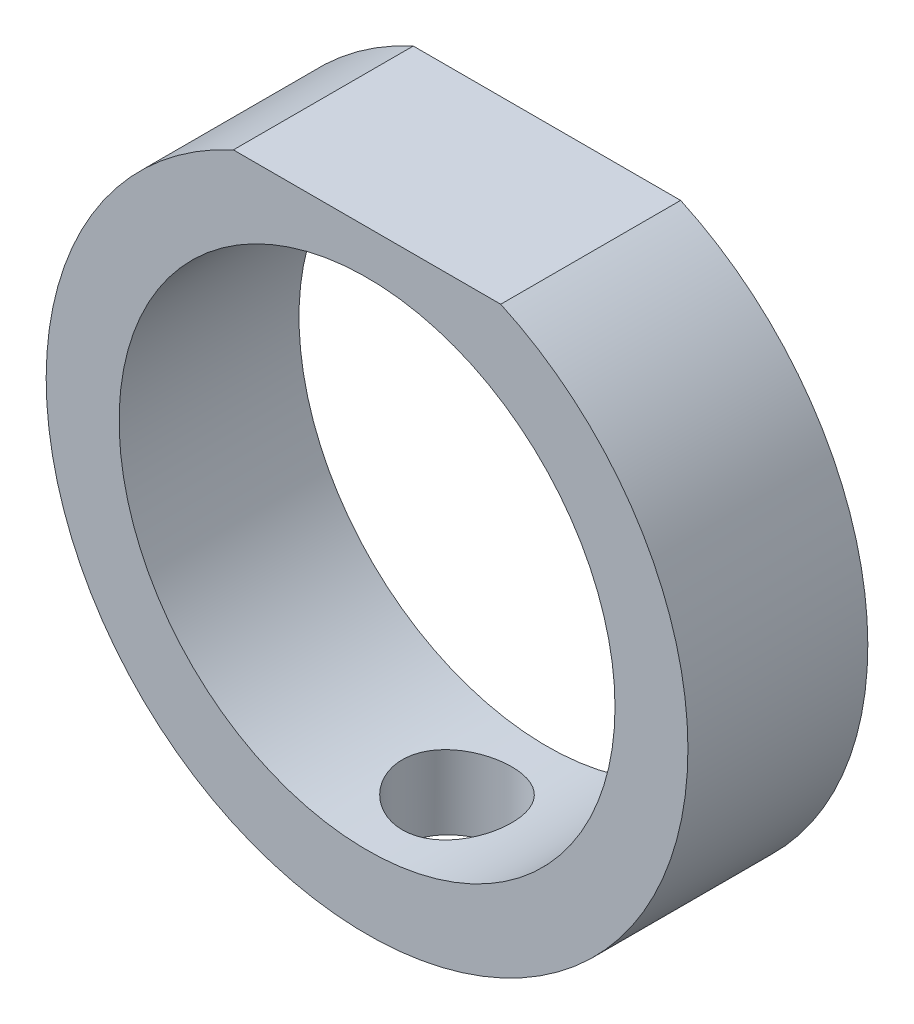
ISO-10303-21;
HEADER;
FILE_DESCRIPTION(('STEP AP214'),'2;1');
FILE_NAME('part.step','',(''),(''),'','','');
FILE_SCHEMA(('AUTOMOTIVE_DESIGN { 1 0 10303 214 1 1 1 1 }'));
ENDSEC;
DATA;
#1=APPLICATION_CONTEXT('core data for automotive mechanical design processes');
#2=APPLICATION_PROTOCOL_DEFINITION('international standard','automotive_design',2000,#1);
#3=PRODUCT_CONTEXT('',#1,'mechanical');
#4=PRODUCT('Part','Part','',(#3));
#5=PRODUCT_RELATED_PRODUCT_CATEGORY('part','',(#4));
#6=PRODUCT_DEFINITION_FORMATION('','',#4);
#7=PRODUCT_DEFINITION_CONTEXT('part definition',#1,'design');
#8=PRODUCT_DEFINITION('design','',#6,#7);
#9=PRODUCT_DEFINITION_SHAPE('','',#8);
#10=(LENGTH_UNIT() NAMED_UNIT(*) SI_UNIT(.MILLI.,.METRE.));
#11=(NAMED_UNIT(*) PLANE_ANGLE_UNIT() SI_UNIT($,.RADIAN.));
#12=(NAMED_UNIT(*) SI_UNIT($,.STERADIAN.) SOLID_ANGLE_UNIT());
#13=UNCERTAINTY_MEASURE_WITH_UNIT(LENGTH_MEASURE(1.E-05),#10,'distance_accuracy_value','');
#14=(GEOMETRIC_REPRESENTATION_CONTEXT(3) GLOBAL_UNCERTAINTY_ASSIGNED_CONTEXT((#13)) GLOBAL_UNIT_ASSIGNED_CONTEXT((#10,
#11,#12)) REPRESENTATION_CONTEXT('',''));
#15=CARTESIAN_POINT('',(0.,0.,0.));
#16=DIRECTION('',(0.,0.,1.));
#17=DIRECTION('',(1.,0.,0.));
#18=AXIS2_PLACEMENT_3D('',#15,#16,#17);
#19=CARTESIAN_POINT('',(0.,0.,7.4));
#20=DIRECTION('',(0.,0.,1.));
#21=DIRECTION('',(1.,0.,0.));
#22=AXIS2_PLACEMENT_3D('',#19,#20,#21);
#23=PLANE('',#22);
#24=CARTESIAN_POINT('',(0.,0.,7.4));
#25=DIRECTION('',(0.,0.,1.));
#26=DIRECTION('',(1.,0.,0.));
#27=AXIS2_PLACEMENT_3D('',#24,#25,#26);
#28=CIRCLE('',#27,13.2);
#29=CARTESIAN_POINT('',(-5.49909083394701,12.,7.4));
#30=VERTEX_POINT('',#29);
#31=CARTESIAN_POINT('',(5.49909083394701,12.,7.4));
#32=VERTEX_POINT('',#31);
#33=EDGE_CURVE('E79',#30,#32,#28,.T.);
#34=ORIENTED_EDGE('',*,*,#33,.T.);
#35=DIRECTION('',(-1.,0.,0.));
#36=VECTOR('',#35,1.);
#37=CARTESIAN_POINT('',(5.49909083394701,12.,7.4));
#38=LINE('',#37,#36);
#39=EDGE_CURVE('E63',#32,#30,#38,.T.);
#40=ORIENTED_EDGE('',*,*,#39,.T.);
#41=EDGE_LOOP('',(#34,#40));
#42=FACE_BOUND('',#41,.T.);
#43=CARTESIAN_POINT('',(0.,0.,7.4));
#44=DIRECTION('',(0.,0.,1.));
#45=DIRECTION('',(1.,0.,0.));
#46=AXIS2_PLACEMENT_3D('',#43,#44,#45);
#47=CIRCLE('',#46,10.2);
#48=CARTESIAN_POINT('',(10.2,0.,7.4));
#49=VERTEX_POINT('',#48);
#50=EDGE_CURVE('E88',#49,#49,#47,.T.);
#51=ORIENTED_EDGE('',*,*,#50,.F.);
#52=EDGE_LOOP('',(#51));
#53=FACE_BOUND('',#52,.T.);
#54=ADVANCED_FACE('F39',(#42,#53),#23,.T.);
#55=CARTESIAN_POINT('',(0.,0.,0.));
#56=DIRECTION('',(0.,0.,1.));
#57=DIRECTION('',(1.,0.,0.));
#58=AXIS2_PLACEMENT_3D('',#55,#56,#57);
#59=PLANE('',#58);
#60=CARTESIAN_POINT('',(0.,0.,0.));
#61=DIRECTION('',(0.,0.,1.));
#62=DIRECTION('',(1.,0.,0.));
#63=AXIS2_PLACEMENT_3D('',#60,#61,#62);
#64=CIRCLE('',#63,13.2);
#65=CARTESIAN_POINT('',(-5.49909083394701,12.,0.));
#66=VERTEX_POINT('',#65);
#67=CARTESIAN_POINT('',(5.49909083394701,12.,0.));
#68=VERTEX_POINT('',#67);
#69=EDGE_CURVE('E80',#66,#68,#64,.T.);
#70=ORIENTED_EDGE('',*,*,#69,.F.);
#71=DIRECTION('',(-1.,0.,0.));
#72=VECTOR('',#71,1.);
#73=CARTESIAN_POINT('',(5.49909083394701,12.,0.));
#74=LINE('',#73,#72);
#75=EDGE_CURVE('E71',#68,#66,#74,.T.);
#76=ORIENTED_EDGE('',*,*,#75,.F.);
#77=EDGE_LOOP('',(#70,#76));
#78=FACE_BOUND('',#77,.T.);
#79=CARTESIAN_POINT('',(0.,0.,0.));
#80=DIRECTION('',(0.,0.,1.));
#81=DIRECTION('',(1.,0.,0.));
#82=AXIS2_PLACEMENT_3D('',#79,#80,#81);
#83=CIRCLE('',#82,10.2);
#84=CARTESIAN_POINT('',(10.2,0.,0.));
#85=VERTEX_POINT('',#84);
#86=EDGE_CURVE('E92',#85,#85,#83,.T.);
#87=ORIENTED_EDGE('',*,*,#86,.T.);
#88=EDGE_LOOP('',(#87));
#89=FACE_BOUND('',#88,.T.);
#90=ADVANCED_FACE('F85',(#78,#89),#59,.F.);
#91=CARTESIAN_POINT('',(0.,0.,7.4));
#92=DIRECTION('',(0.,0.,-1.));
#93=DIRECTION('',(-1.,0.,0.));
#94=AXIS2_PLACEMENT_3D('',#91,#92,#93);
#95=CYLINDRICAL_SURFACE('',#94,13.2);
#96=CARTESIAN_POINT('',(0.,-13.2,5.95));
#97=CARTESIAN_POINT('',(0.125409455778498,-13.1999978244003,5.94999500950394));
#98=CARTESIAN_POINT('',(0.250886302575425,-13.1981941924504,5.93947955691947));
#99=CARTESIAN_POINT('',(0.498317874434517,-13.1911728551391,5.89771473011811));
#100=CARTESIAN_POINT('',(0.620269302152406,-13.1859520551002,5.86644656133511));
#101=CARTESIAN_POINT('',(0.857034657811282,-13.1726816919663,5.78415022351963));
#102=CARTESIAN_POINT('',(0.971854438258892,-13.1646344854124,5.73313851223649));
#103=CARTESIAN_POINT('',(1.19129128079651,-13.1465950676666,5.61284686500907));
#104=CARTESIAN_POINT('',(1.2959094483739,-13.1366030675727,5.54356891148774));
#105=CARTESIAN_POINT('',(1.49303141580243,-13.1156694036753,5.38797608829722));
#106=CARTESIAN_POINT('',(1.58541863133445,-13.1047200528632,5.30151453545561));
#107=CARTESIAN_POINT('',(1.75444883172078,-13.0831642706705,5.11432454005701));
#108=CARTESIAN_POINT('',(1.83109079999595,-13.0725578614687,5.01359517701932));
#109=CARTESIAN_POINT('',(1.96692523507556,-13.0528143773495,4.799924003104));
#110=CARTESIAN_POINT('',(2.02600183817552,-13.0436872318606,4.68690753800796));
#111=CARTESIAN_POINT('',(2.12428751144041,-13.0280426366238,4.45237343839689));
#112=CARTESIAN_POINT('',(2.16349798714382,-13.0215250022585,4.33085640599374));
#113=CARTESIAN_POINT('',(2.22056983950697,-13.0119140560865,4.08400850732135));
#114=CARTESIAN_POINT('',(2.23863285645729,-13.0087884229805,3.95872554319996));
#115=CARTESIAN_POINT('',(2.25352235706125,-13.0062176616362,3.70687102680469));
#116=CARTESIAN_POINT('',(2.25035041268358,-13.0067722609599,3.5802995706071));
#117=CARTESIAN_POINT('',(2.22302414424092,-13.0114698059943,3.33090407341197));
#118=CARTESIAN_POINT('',(2.19909681130095,-13.0155739309174,3.20805432307375));
#119=CARTESIAN_POINT('',(2.1312954186337,-13.0268472921743,2.96813885595866));
#120=CARTESIAN_POINT('',(2.08742064616477,-13.0340166380309,2.85107334602411));
#121=CARTESIAN_POINT('',(1.98074110301858,-13.0506543375823,2.62537255199904));
#122=CARTESIAN_POINT('',(1.91784252686744,-13.0601340374788,2.51678247672581));
#123=CARTESIAN_POINT('',(1.77496739098768,-13.0803165117723,2.31161201094186));
#124=CARTESIAN_POINT('',(1.69498939103027,-13.0910193892789,2.21503263432523));
#125=CARTESIAN_POINT('',(1.51899116815751,-13.1126126070143,2.03531158258943));
#126=CARTESIAN_POINT('',(1.42277629228631,-13.1235035779331,1.95236048598242));
#127=CARTESIAN_POINT('',(1.2176926148893,-13.14411763061,1.8037509385748));
#128=CARTESIAN_POINT('',(1.10882372473172,-13.1538407041869,1.73809260890743));
#129=CARTESIAN_POINT('',(0.881339820975452,-13.1710381947407,1.62591320489477));
#130=CARTESIAN_POINT('',(0.762716086488442,-13.1785105711375,1.57940948299907));
#131=CARTESIAN_POINT('',(0.519185992578675,-13.1903484687363,1.50703895706115));
#132=CARTESIAN_POINT('',(0.394280184221628,-13.1947142619416,1.48117034624457));
#133=CARTESIAN_POINT('',(0.143373645073224,-13.1998103746572,1.45106390673614));
#134=CARTESIAN_POINT('',(0.0174051581335394,-13.2005846477273,1.44656454163573));
#135=CARTESIAN_POINT('',(-0.233485433652698,-13.1985310441783,1.45862630617321));
#136=CARTESIAN_POINT('',(-0.358407580473718,-13.1957033127589,1.47518658688024));
#137=CARTESIAN_POINT('',(-0.602847805245001,-13.1867906661851,1.52868003372336));
#138=CARTESIAN_POINT('',(-0.722395151159444,-13.1807265389396,1.56548322197042));
#139=CARTESIAN_POINT('',(-0.953622985244235,-13.1660182924589,1.65827885296741));
#140=CARTESIAN_POINT('',(-1.06530301448108,-13.157374022867,1.71427241405646));
#141=CARTESIAN_POINT('',(-1.27875862515587,-13.1383552171138,1.84445483507808));
#142=CARTESIAN_POINT('',(-1.3804335657315,-13.1279654853041,1.91880644911685));
#143=CARTESIAN_POINT('',(-1.56995674899927,-13.1066528080724,2.08337116130942));
#144=CARTESIAN_POINT('',(-1.65780393724917,-13.0957298220699,2.17358546797146));
#145=CARTESIAN_POINT('',(-1.81815166670289,-13.0744389541732,2.36848968105241));
#146=CARTESIAN_POINT('',(-1.89047518282883,-13.0640783889542,2.4733261525212));
#147=CARTESIAN_POINT('',(-2.01648479894649,-13.0452238559488,2.69381386509674));
#148=CARTESIAN_POINT('',(-2.07017150907855,-13.0367298270581,2.80946475199877));
#149=CARTESIAN_POINT('',(-2.15712115186544,-13.0226254350842,3.04781133583045));
#150=CARTESIAN_POINT('',(-2.19047098484463,-13.0170028193314,3.1704745731975));
#151=CARTESIAN_POINT('',(-2.23607278748233,-13.0092475881375,3.41976605991621));
#152=CARTESIAN_POINT('',(-2.24832668426712,-13.0071146539128,3.54639394601872));
#153=CARTESIAN_POINT('',(-2.25133314503081,-13.0065944525744,3.79825161352331));
#154=CARTESIAN_POINT('',(-2.24236444734335,-13.0081586271914,3.92347805417182));
#155=CARTESIAN_POINT('',(-2.203784337087,-13.0147497617597,4.17061198805333));
#156=CARTESIAN_POINT('',(-2.17417300044445,-13.0197767089744,4.29251949349208));
#157=CARTESIAN_POINT('',(-2.0952568713465,-13.0327081745355,4.52943992574897));
#158=CARTESIAN_POINT('',(-2.04597715691846,-13.0406090273961,4.64446141857874));
#159=CARTESIAN_POINT('',(-1.92915206561882,-13.0584014458541,4.86464921493404));
#160=CARTESIAN_POINT('',(-1.86160571479972,-13.0682931175915,4.96981499256608));
#161=CARTESIAN_POINT('',(-1.70917439089517,-13.0891060254436,5.16871231640438));
#162=CARTESIAN_POINT('',(-1.62408472161733,-13.1000385113788,5.26228583325446));
#163=CARTESIAN_POINT('',(-1.4394130687782,-13.1216124908,5.43392127317776));
#164=CARTESIAN_POINT('',(-1.3398277493501,-13.1322539166333,5.51197961595476));
#165=CARTESIAN_POINT('',(-1.12813118871305,-13.1521364914137,5.65088891353605));
#166=CARTESIAN_POINT('',(-1.01593428521987,-13.1613669172559,5.71161087313564));
#167=CARTESIAN_POINT('',(-0.782819118312254,-13.177283129886,5.81325109324294));
#168=CARTESIAN_POINT('',(-0.66190959190489,-13.1839714248132,5.85418888426527));
#169=CARTESIAN_POINT('',(-0.450457590357637,-13.1926067413986,5.90631169899501));
#170=CARTESIAN_POINT('',(-0.36118732503303,-13.1953642507301,5.92266827385341));
#171=CARTESIAN_POINT('',(-0.181289763242887,-13.1990616496176,5.94451412769566));
#172=CARTESIAN_POINT('',(-0.0906624919217113,-13.2000015728103,5.95000360778863));
#173=CARTESIAN_POINT('',(0.,-13.2,5.95));
#174=B_SPLINE_CURVE_WITH_KNOTS('',3,(#96,#97,#98,#99,#100,#101,#102,#103,#104,#105,#106,#107,
#108,#109,#110,#111,#112,#113,#114,#115,#116,#117,#118,#119,#120,#121,#122,#123,#124,#125,#126,
#127,#128,#129,#130,#131,#132,#133,#134,#135,#136,#137,#138,#139,#140,#141,#142,#143,#144,#145,
#146,#147,#148,#149,#150,#151,#152,#153,#154,#155,#156,#157,#158,#159,#160,#161,#162,#163,#164,
#165,#166,#167,#168,#169,#170,#171,#172,#173),.UNSPECIFIED.,.T.,.F.,(4,2,2,2,2,2,2,2,2,2,2,2,2,
2,2,2,2,2,2,2,2,2,2,2,2,2,2,2,2,2,2,2,2,2,2,2,2,2,4),(0.,0.375896942338025,0.752134778739308,
1.12805966531345,1.50394376979451,1.88318613890499,2.26245298580189,2.64416869396865,
3.02585739178509,3.40387627060193,3.78186716597858,4.15577555410983,4.5296973034058,
4.9054937645651,5.28132192742334,5.66202563889338,6.04273201706463,6.42378252837141,
6.80479967189633,7.18114134842146,7.55746785479858,7.93140574253461,8.30536542560012,
8.68276764346045,9.06019862639074,9.44172850604903,9.82324589382782,10.2031214046729,
10.582962211823,10.9578419215139,11.3327202523552,11.7071221164475,12.0815439469787,
12.4606105971547,12.8397646198119,13.2216703765961,13.6031983500147,13.8749512572609,
14.1466991353341),.UNSPECIFIED.);
#175=CARTESIAN_POINT('',(0.,-13.2,5.95));
#176=VERTEX_POINT('',#175);
#177=EDGE_CURVE('E101',#176,#176,#174,.T.);
#178=ORIENTED_EDGE('',*,*,#177,.T.);
#179=EDGE_LOOP('',(#178));
#180=FACE_BOUND('',#179,.T.);
#181=ORIENTED_EDGE('',*,*,#69,.T.);
#182=DIRECTION('',(0.,0.,-1.));
#183=VECTOR('',#182,1.);
#184=CARTESIAN_POINT('',(5.49909083394701,12.,7.4));
#185=LINE('',#184,#183);
#186=EDGE_CURVE('E11',#32,#68,#185,.T.);
#187=ORIENTED_EDGE('',*,*,#186,.F.);
#188=ORIENTED_EDGE('',*,*,#33,.F.);
#189=DIRECTION('',(0.,0.,-1.));
#190=VECTOR('',#189,1.);
#191=CARTESIAN_POINT('',(-5.49909083394701,12.,7.4));
#192=LINE('',#191,#190);
#193=EDGE_CURVE('E56',#30,#66,#192,.T.);
#194=ORIENTED_EDGE('',*,*,#193,.T.);
#195=EDGE_LOOP('',(#181,#187,#188,#194));
#196=FACE_BOUND('',#195,.T.);
#197=ADVANCED_FACE('F41',(#180,#196),#95,.T.);
#198=CARTESIAN_POINT('',(5.49909083394701,12.,7.4));
#199=DIRECTION('',(0.,-1.,0.));
#200=DIRECTION('',(0.,0.,-1.));
#201=AXIS2_PLACEMENT_3D('',#198,#199,#200);
#202=PLANE('',#201);
#203=ORIENTED_EDGE('',*,*,#75,.T.);
#204=ORIENTED_EDGE('',*,*,#193,.F.);
#205=ORIENTED_EDGE('',*,*,#39,.F.);
#206=ORIENTED_EDGE('',*,*,#186,.T.);
#207=EDGE_LOOP('',(#203,#204,#205,#206));
#208=FACE_BOUND('',#207,.T.);
#209=ADVANCED_FACE('F74',(#208),#202,.F.);
#210=CARTESIAN_POINT('',(0.,0.,7.4));
#211=DIRECTION('',(0.,0.,-1.));
#212=DIRECTION('',(-1.,0.,0.));
#213=AXIS2_PLACEMENT_3D('',#210,#211,#212);
#214=CYLINDRICAL_SURFACE('',#213,10.2);
#215=CARTESIAN_POINT('',(0.,-10.2,5.95));
#216=CARTESIAN_POINT('',(0.124764174505007,-10.1999977027666,5.94999577656357));
#217=CARTESIAN_POINT('',(0.249579153208696,-10.1976876313943,5.93958757126949));
#218=CARTESIAN_POINT('',(0.495661985850826,-10.1886954635131,5.89827403882562));
#219=CARTESIAN_POINT('',(0.616927271339808,-10.1820102791978,5.86735423507471));
#220=CARTESIAN_POINT('',(0.852318898678438,-10.1650120015536,5.786034497785));
#221=CARTESIAN_POINT('',(0.966452614575013,-10.1547027311693,5.73565508611887));
#222=CARTESIAN_POINT('',(1.1846437031207,-10.1315681097671,5.6169117547838));
#223=CARTESIAN_POINT('',(1.28870130187285,-10.1187428152272,5.5485482387972));
#224=CARTESIAN_POINT('',(1.48548669232062,-10.091746625768,5.3945978533885));
#225=CARTESIAN_POINT('',(1.57802668841411,-10.0775588054433,5.30877388398141));
#226=CARTESIAN_POINT('',(1.74752142602877,-10.0495554871774,5.1228477511948));
#227=CARTESIAN_POINT('',(1.82447475890951,-10.0357400229855,5.02274429870294));
#228=CARTESIAN_POINT('',(1.96144336336071,-10.0098785747494,4.80970835306626));
#229=CARTESIAN_POINT('',(2.02125814433491,-9.99785426794003,4.69664409040166));
#230=CARTESIAN_POINT('',(2.12096549481324,-9.97717973314191,4.46175953918245));
#231=CARTESIAN_POINT('',(2.16086049019061,-9.96852909432888,4.33994031889293));
#232=CARTESIAN_POINT('',(2.21897402474801,-9.9557538178659,4.09304260430619));
#233=CARTESIAN_POINT('',(2.23752535760456,-9.95155977373163,3.96804610980341));
#234=CARTESIAN_POINT('',(2.25345984807385,-9.94796413881408,3.71665001482526));
#235=CARTESIAN_POINT('',(2.25084565369365,-9.9485619485246,3.59025059184539));
#236=CARTESIAN_POINT('',(2.22479098131645,-9.95441966531722,3.34211492336589));
#237=CARTESIAN_POINT('',(2.20173765027849,-9.9595929027298,3.22033567018278));
#238=CARTESIAN_POINT('',(2.13607269880298,-9.97388149095551,2.98241691356938));
#239=CARTESIAN_POINT('',(2.09345996425897,-9.98299706632309,2.86627773181514));
#240=CARTESIAN_POINT('',(1.98953179202404,-10.0042283104756,2.64185035404454));
#241=CARTESIAN_POINT('',(1.9280679633098,-10.0163676336361,2.53363320611943));
#242=CARTESIAN_POINT('',(1.78828664178137,-10.0422641355573,2.3289057694605));
#243=CARTESIAN_POINT('',(1.70996681445608,-10.056021538298,2.23239710521864));
#244=CARTESIAN_POINT('',(1.53664981310273,-10.0839755658964,2.05159779280271));
#245=CARTESIAN_POINT('',(1.44132356993324,-10.0981751941245,1.96762274365019));
#246=CARTESIAN_POINT('',(1.23777995455844,-10.1251381918741,1.81679925206589));
#247=CARTESIAN_POINT('',(1.12956234108643,-10.1379015345065,1.74995113024457));
#248=CARTESIAN_POINT('',(0.902919035635492,-10.1605964257697,1.63519899501605));
#249=CARTESIAN_POINT('',(0.784471456765543,-10.1705216966576,1.58733688907402));
#250=CARTESIAN_POINT('',(0.540947212530485,-10.1863755462739,1.51228343550781));
#251=CARTESIAN_POINT('',(0.415871530929465,-10.1923047163342,1.48508902945889));
#252=CARTESIAN_POINT('',(0.165348136015659,-10.1994139510997,1.45260324145342));
#253=CARTESIAN_POINT('',(0.0399588926663982,-10.2006874610742,1.44688082539056));
#254=CARTESIAN_POINT('',(-0.209983939541013,-10.1986039845559,1.45633237916171));
#255=CARTESIAN_POINT('',(-0.334537585501884,-10.1952473177851,1.47150490616274));
#256=CARTESIAN_POINT('',(-0.577841544666081,-10.1843396728686,1.52195833714203));
#257=CARTESIAN_POINT('',(-0.696641153218767,-10.17683598172,1.55701265256782));
#258=CARTESIAN_POINT('',(-0.926673931622173,-10.1584743955523,1.64598268506244));
#259=CARTESIAN_POINT('',(-1.03790644833292,-10.1476162114432,1.69990002779873));
#260=CARTESIAN_POINT('',(-1.25142613768722,-10.1235198955913,1.82596013164838));
#261=CARTESIAN_POINT('',(-1.35356048954898,-10.1102495839341,1.89835545090419));
#262=CARTESIAN_POINT('',(-1.54438559075579,-10.0828657904622,2.05898445598761));
#263=CARTESIAN_POINT('',(-1.63307455930169,-10.0687521973021,2.14722023646052));
#264=CARTESIAN_POINT('',(-1.79619959237253,-10.0409489876431,2.3390048652431));
#265=CARTESIAN_POINT('',(-1.87033694324694,-10.0272722983527,2.44281001253349));
#266=CARTESIAN_POINT('',(-2.00012805974088,-10.0021935125848,2.66165069116205));
#267=CARTESIAN_POINT('',(-2.05578262946161,-9.99079131716326,2.77668573365707));
#268=CARTESIAN_POINT('',(-2.14664942055242,-9.97166255922927,3.01410159248014));
#269=CARTESIAN_POINT('',(-2.1819772751943,-9.96391525136957,3.1364363979706));
#270=CARTESIAN_POINT('',(-2.23152506529072,-9.9529368378586,3.38549920096257));
#271=CARTESIAN_POINT('',(-2.24574844264431,-9.94970499579147,3.51222647865134));
#272=CARTESIAN_POINT('',(-2.25253510422282,-9.94817040033812,3.76346361037226));
#273=CARTESIAN_POINT('',(-2.24557220291493,-9.94975982073482,3.88796023976119));
#274=CARTESIAN_POINT('',(-2.21124461801134,-9.95744450003778,4.13395922828179));
#275=CARTESIAN_POINT('',(-2.18388018339175,-9.96353970395638,4.25546162393579));
#276=CARTESIAN_POINT('',(-2.10975698328272,-9.97949617321249,4.491638986583));
#277=CARTESIAN_POINT('',(-2.063068295671,-9.98934382047356,4.60633692836838));
#278=CARTESIAN_POINT('',(-1.95168169697152,-10.0117007150081,4.82634172244347));
#279=CARTESIAN_POINT('',(-1.88698187279526,-10.0242102449854,4.93164757556417));
#280=CARTESIAN_POINT('',(-1.73984289144314,-10.0508026767051,5.13221212680876));
#281=CARTESIAN_POINT('',(-1.65706654912887,-10.0649126259551,5.2272199185806));
#282=CARTESIAN_POINT('',(-1.47680613231873,-10.0929355233117,5.40215184962185));
#283=CARTESIAN_POINT('',(-1.37931865903553,-10.1068484250788,5.48207249360101));
#284=CARTESIAN_POINT('',(-1.17084712832558,-10.1331282559513,5.62557598724589));
#285=CARTESIAN_POINT('',(-1.05970142105879,-10.145472269695,5.68892843957059));
#286=CARTESIAN_POINT('',(-0.828089284477381,-10.1669930248578,5.79595176542446));
#287=CARTESIAN_POINT('',(-0.707630707859559,-10.1761723998273,5.8396390132513));
#288=CARTESIAN_POINT('',(-0.489224208034146,-10.1887072558327,5.89837756476082));
#289=CARTESIAN_POINT('',(-0.392450775874068,-10.1929156488516,5.91769877776524));
#290=CARTESIAN_POINT('',(-0.197128747362552,-10.1985628651269,5.94351137037539));
#291=CARTESIAN_POINT('',(-0.098580232450924,-10.2000018151188,5.9500033370745));
#292=CARTESIAN_POINT('',(0.,-10.2,5.95));
#293=B_SPLINE_CURVE_WITH_KNOTS('',3,(#215,#216,#217,#218,#219,#220,#221,#222,#223,#224,#225,
#226,#227,#228,#229,#230,#231,#232,#233,#234,#235,#236,#237,#238,#239,#240,#241,#242,#243,#244,
#245,#246,#247,#248,#249,#250,#251,#252,#253,#254,#255,#256,#257,#258,#259,#260,#261,#262,#263,
#264,#265,#266,#267,#268,#269,#270,#271,#272,#273,#274,#275,#276,#277,#278,#279,#280,#281,#282,
#283,#284,#285,#286,#287,#288,#289,#290,#291,#292),.UNSPECIFIED.,.T.,.F.,(4,2,2,2,2,2,2,2,2,2,2,
2,2,2,2,2,2,2,2,2,2,2,2,2,2,2,2,2,2,2,2,2,2,2,2,2,2,2,4),(0.,0.373931657494397,
0.748127508288031,1.12192980925239,1.49572372033468,1.87498021206442,2.25427096371775,
2.63783275873624,3.02134783139575,3.39879838665644,3.77620172002283,4.14660566731301,
4.51703071548452,4.89044993342212,5.26392090225035,5.64561032997554,6.02730690228011,
6.40984135949883,6.79231919789763,7.16707669361207,7.54180831295246,7.91235262376948,
8.28292887698219,8.65887016158695,9.03486119502435,9.41790830506423,9.80093874829397,
10.1817681233911,10.5625353827406,10.9348501476368,11.3071603689547,11.6781321046278,
12.0491432588424,12.4277778248663,12.8065000030687,13.190238003032,13.5736558885409,
13.8691249755151,14.1645805408872),.UNSPECIFIED.);
#294=CARTESIAN_POINT('',(0.,-10.2,5.95));
#295=VERTEX_POINT('',#294);
#296=EDGE_CURVE('E44',#295,#295,#293,.T.);
#297=ORIENTED_EDGE('',*,*,#296,.F.);
#298=EDGE_LOOP('',(#297));
#299=FACE_BOUND('',#298,.T.);
#300=ORIENTED_EDGE('',*,*,#50,.T.);
#301=EDGE_LOOP('',(#300));
#302=FACE_BOUND('',#301,.T.);
#303=ORIENTED_EDGE('',*,*,#86,.F.);
#304=EDGE_LOOP('',(#303));
#305=FACE_BOUND('',#304,.T.);
#306=ADVANCED_FACE('F111',(#299,#302,#305),#214,.F.);
#307=CARTESIAN_POINT('',(0.,-13.2,3.7));
#308=DIRECTION('',(0.,1.,0.));
#309=DIRECTION('',(0.,0.,1.));
#310=AXIS2_PLACEMENT_3D('',#307,#308,#309);
#311=CYLINDRICAL_SURFACE('',#310,2.25);
#312=ORIENTED_EDGE('',*,*,#296,.T.);
#313=EDGE_LOOP('',(#312));
#314=FACE_BOUND('',#313,.T.);
#315=ORIENTED_EDGE('',*,*,#177,.F.);
#316=EDGE_LOOP('',(#315));
#317=FACE_BOUND('',#316,.T.);
#318=ADVANCED_FACE('F108',(#314,#317),#311,.F.);
#319=CLOSED_SHELL('',(#54,#90,#197,#209,#306,#318));
#320=MANIFOLD_SOLID_BREP('B2',#319);
#321=ADVANCED_BREP_SHAPE_REPRESENTATION('',(#18,#320),#14);
#322=SHAPE_DEFINITION_REPRESENTATION(#9,#321);
ENDSEC;
END-ISO-10303-21;
